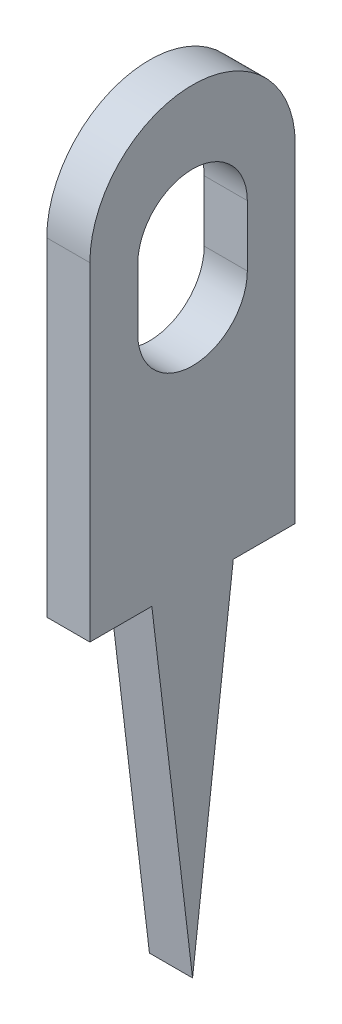
ISO-10303-21;
HEADER;
FILE_DESCRIPTION(('STEP AP214'),'2;1');
FILE_NAME('part.step','',(''),(''),'','','');
FILE_SCHEMA(('AUTOMOTIVE_DESIGN { 1 0 10303 214 1 1 1 1 }'));
ENDSEC;
DATA;
#1=APPLICATION_CONTEXT('core data for automotive mechanical design processes');
#2=APPLICATION_PROTOCOL_DEFINITION('international standard','automotive_design',2000,#1);
#3=PRODUCT_CONTEXT('',#1,'mechanical');
#4=PRODUCT('Part','Part','',(#3));
#5=PRODUCT_RELATED_PRODUCT_CATEGORY('part','',(#4));
#6=PRODUCT_DEFINITION_FORMATION('','',#4);
#7=PRODUCT_DEFINITION_CONTEXT('part definition',#1,'design');
#8=PRODUCT_DEFINITION('design','',#6,#7);
#9=PRODUCT_DEFINITION_SHAPE('','',#8);
#10=(LENGTH_UNIT() NAMED_UNIT(*) SI_UNIT(.MILLI.,.METRE.));
#11=(NAMED_UNIT(*) PLANE_ANGLE_UNIT() SI_UNIT($,.RADIAN.));
#12=(NAMED_UNIT(*) SI_UNIT($,.STERADIAN.) SOLID_ANGLE_UNIT());
#13=UNCERTAINTY_MEASURE_WITH_UNIT(LENGTH_MEASURE(1.E-05),#10,'distance_accuracy_value','');
#14=(GEOMETRIC_REPRESENTATION_CONTEXT(3) GLOBAL_UNCERTAINTY_ASSIGNED_CONTEXT((#13)) GLOBAL_UNIT_ASSIGNED_CONTEXT((#10,
#11,#12)) REPRESENTATION_CONTEXT('',''));
#15=CARTESIAN_POINT('',(0.,0.,0.));
#16=DIRECTION('',(0.,0.,1.));
#17=DIRECTION('',(1.,0.,0.));
#18=AXIS2_PLACEMENT_3D('',#15,#16,#17);
#19=CARTESIAN_POINT('',(-0.315,0.,0.595));
#20=DIRECTION('',(0.,-0.118166265014676,0.992993823652736));
#21=DIRECTION('',(0.,-0.992993823652736,-0.118166265014676));
#22=AXIS2_PLACEMENT_3D('',#19,#20,#21);
#23=PLANE('',#22);
#24=DIRECTION('',(1.,0.,0.));
#25=VECTOR('',#24,1.);
#26=CARTESIAN_POINT('',(-0.315,-5.,0.));
#27=LINE('',#26,#25);
#28=CARTESIAN_POINT('',(-0.315,-5.,0.));
#29=VERTEX_POINT('',#28);
#30=CARTESIAN_POINT('',(0.315,-5.,0.));
#31=VERTEX_POINT('',#30);
#32=EDGE_CURVE('E42',#29,#31,#27,.T.);
#33=ORIENTED_EDGE('',*,*,#32,.T.);
#34=DIRECTION('',(0.,-0.992993823652736,-0.118166265014676));
#35=VECTOR('',#34,1.);
#36=CARTESIAN_POINT('',(0.315,0.,0.595));
#37=LINE('',#36,#35);
#38=CARTESIAN_POINT('',(0.315,0.,0.595));
#39=VERTEX_POINT('',#38);
#40=EDGE_CURVE('E158',#39,#31,#37,.T.);
#41=ORIENTED_EDGE('',*,*,#40,.F.);
#42=DIRECTION('',(1.,0.,0.));
#43=VECTOR('',#42,1.);
#44=CARTESIAN_POINT('',(-0.315,0.,0.595));
#45=LINE('',#44,#43);
#46=CARTESIAN_POINT('',(-0.315,0.,0.595));
#47=VERTEX_POINT('',#46);
#48=EDGE_CURVE('E11',#47,#39,#45,.T.);
#49=ORIENTED_EDGE('',*,*,#48,.F.);
#50=DIRECTION('',(0.,-0.992993823652736,-0.118166265014676));
#51=VECTOR('',#50,1.);
#52=CARTESIAN_POINT('',(-0.315,0.,0.595));
#53=LINE('',#52,#51);
#54=EDGE_CURVE('E198',#47,#29,#53,.T.);
#55=ORIENTED_EDGE('',*,*,#54,.T.);
#56=EDGE_LOOP('',(#33,#41,#49,#55));
#57=FACE_BOUND('',#56,.T.);
#58=ADVANCED_FACE('F39',(#57),#23,.T.);
#59=CARTESIAN_POINT('',(-0.315,0.,1.5));
#60=DIRECTION('',(0.,-1.,0.));
#61=DIRECTION('',(0.,0.,-1.));
#62=AXIS2_PLACEMENT_3D('',#59,#60,#61);
#63=PLANE('',#62);
#64=ORIENTED_EDGE('',*,*,#48,.T.);
#65=DIRECTION('',(0.,0.,-1.));
#66=VECTOR('',#65,1.);
#67=CARTESIAN_POINT('',(0.315,0.,1.5));
#68=LINE('',#67,#66);
#69=CARTESIAN_POINT('',(0.315,0.,1.5));
#70=VERTEX_POINT('',#69);
#71=EDGE_CURVE('E182',#70,#39,#68,.T.);
#72=ORIENTED_EDGE('',*,*,#71,.F.);
#73=DIRECTION('',(1.,0.,0.));
#74=VECTOR('',#73,1.);
#75=CARTESIAN_POINT('',(-0.315,0.,1.5));
#76=LINE('',#75,#74);
#77=CARTESIAN_POINT('',(-0.315,0.,1.5));
#78=VERTEX_POINT('',#77);
#79=EDGE_CURVE('E48',#78,#70,#76,.T.);
#80=ORIENTED_EDGE('',*,*,#79,.F.);
#81=DIRECTION('',(0.,0.,-1.));
#82=VECTOR('',#81,1.);
#83=CARTESIAN_POINT('',(-0.315,0.,1.5));
#84=LINE('',#83,#82);
#85=EDGE_CURVE('E226',#78,#47,#84,.T.);
#86=ORIENTED_EDGE('',*,*,#85,.T.);
#87=EDGE_LOOP('',(#64,#72,#80,#86));
#88=FACE_BOUND('',#87,.T.);
#89=ADVANCED_FACE('F252',(#88),#63,.T.);
#90=CARTESIAN_POINT('',(-0.315,0.,1.5));
#91=DIRECTION('',(0.,0.,1.));
#92=DIRECTION('',(1.,0.,0.));
#93=AXIS2_PLACEMENT_3D('',#90,#91,#92);
#94=PLANE('',#93);
#95=ORIENTED_EDGE('',*,*,#79,.T.);
#96=DIRECTION('',(0.,-1.,0.));
#97=VECTOR('',#96,1.);
#98=CARTESIAN_POINT('',(0.315,0.,1.5));
#99=LINE('',#98,#97);
#100=CARTESIAN_POINT('',(0.315,4.8,1.5));
#101=VERTEX_POINT('',#100);
#102=EDGE_CURVE('E178',#101,#70,#99,.T.);
#103=ORIENTED_EDGE('',*,*,#102,.F.);
#104=DIRECTION('',(1.,0.,0.));
#105=VECTOR('',#104,1.);
#106=CARTESIAN_POINT('',(-0.315,4.8,1.5));
#107=LINE('',#106,#105);
#108=CARTESIAN_POINT('',(-0.315,4.8,1.5));
#109=VERTEX_POINT('',#108);
#110=EDGE_CURVE('E232',#109,#101,#107,.T.);
#111=ORIENTED_EDGE('',*,*,#110,.F.);
#112=DIRECTION('',(0.,-1.,0.));
#113=VECTOR('',#112,1.);
#114=CARTESIAN_POINT('',(-0.315,0.,1.5));
#115=LINE('',#114,#113);
#116=EDGE_CURVE('E222',#109,#78,#115,.T.);
#117=ORIENTED_EDGE('',*,*,#116,.T.);
#118=EDGE_LOOP('',(#95,#103,#111,#117));
#119=FACE_BOUND('',#118,.T.);
#120=ADVANCED_FACE('F269',(#119),#94,.T.);
#121=CARTESIAN_POINT('',(-0.315,4.8,0.));
#122=DIRECTION('',(1.,0.,0.));
#123=DIRECTION('',(0.,0.,-1.));
#124=AXIS2_PLACEMENT_3D('',#121,#122,#123);
#125=CYLINDRICAL_SURFACE('',#124,1.5);
#126=ORIENTED_EDGE('',*,*,#110,.T.);
#127=CARTESIAN_POINT('',(0.315,4.8,0.));
#128=DIRECTION('',(1.,0.,0.));
#129=DIRECTION('',(0.,0.,-1.));
#130=AXIS2_PLACEMENT_3D('',#127,#128,#129);
#131=CIRCLE('',#130,1.5);
#132=CARTESIAN_POINT('',(0.315,4.8,-1.5));
#133=VERTEX_POINT('',#132);
#134=EDGE_CURVE('E174',#133,#101,#131,.T.);
#135=ORIENTED_EDGE('',*,*,#134,.F.);
#136=DIRECTION('',(1.,0.,0.));
#137=VECTOR('',#136,1.);
#138=CARTESIAN_POINT('',(-0.315,4.8,-1.5));
#139=LINE('',#138,#137);
#140=CARTESIAN_POINT('',(-0.315,4.8,-1.5));
#141=VERTEX_POINT('',#140);
#142=EDGE_CURVE('E235',#141,#133,#139,.T.);
#143=ORIENTED_EDGE('',*,*,#142,.F.);
#144=CARTESIAN_POINT('',(-0.315,4.8,0.));
#145=DIRECTION('',(1.,0.,0.));
#146=DIRECTION('',(0.,0.,-1.));
#147=AXIS2_PLACEMENT_3D('',#144,#145,#146);
#148=CIRCLE('',#147,1.5);
#149=EDGE_CURVE('E218',#141,#109,#148,.T.);
#150=ORIENTED_EDGE('',*,*,#149,.T.);
#151=EDGE_LOOP('',(#126,#135,#143,#150));
#152=FACE_BOUND('',#151,.T.);
#153=ADVANCED_FACE('F267',(#152),#125,.T.);
#154=CARTESIAN_POINT('',(-0.315,0.,-1.5));
#155=DIRECTION('',(0.,0.,-1.));
#156=DIRECTION('',(-1.,0.,0.));
#157=AXIS2_PLACEMENT_3D('',#154,#155,#156);
#158=PLANE('',#157);
#159=ORIENTED_EDGE('',*,*,#142,.T.);
#160=DIRECTION('',(0.,1.,0.));
#161=VECTOR('',#160,1.);
#162=CARTESIAN_POINT('',(0.315,0.,-1.5));
#163=LINE('',#162,#161);
#164=CARTESIAN_POINT('',(0.315,0.,-1.5));
#165=VERTEX_POINT('',#164);
#166=EDGE_CURVE('E170',#165,#133,#163,.T.);
#167=ORIENTED_EDGE('',*,*,#166,.F.);
#168=DIRECTION('',(1.,0.,0.));
#169=VECTOR('',#168,1.);
#170=CARTESIAN_POINT('',(-0.315,0.,-1.5));
#171=LINE('',#170,#169);
#172=CARTESIAN_POINT('',(-0.315,0.,-1.5));
#173=VERTEX_POINT('',#172);
#174=EDGE_CURVE('E238',#173,#165,#171,.T.);
#175=ORIENTED_EDGE('',*,*,#174,.F.);
#176=DIRECTION('',(0.,1.,0.));
#177=VECTOR('',#176,1.);
#178=CARTESIAN_POINT('',(-0.315,0.,-1.5));
#179=LINE('',#178,#177);
#180=EDGE_CURVE('E214',#173,#141,#179,.T.);
#181=ORIENTED_EDGE('',*,*,#180,.T.);
#182=EDGE_LOOP('',(#159,#167,#175,#181));
#183=FACE_BOUND('',#182,.T.);
#184=ADVANCED_FACE('F265',(#183),#158,.T.);
#185=CARTESIAN_POINT('',(-0.315,0.,-1.5));
#186=DIRECTION('',(0.,-1.,0.));
#187=DIRECTION('',(0.,0.,-1.));
#188=AXIS2_PLACEMENT_3D('',#185,#186,#187);
#189=PLANE('',#188);
#190=ORIENTED_EDGE('',*,*,#174,.T.);
#191=DIRECTION('',(0.,0.,-1.));
#192=VECTOR('',#191,1.);
#193=CARTESIAN_POINT('',(0.315,0.,-1.5));
#194=LINE('',#193,#192);
#195=CARTESIAN_POINT('',(0.315,0.,-0.595));
#196=VERTEX_POINT('',#195);
#197=EDGE_CURVE('E166',#196,#165,#194,.T.);
#198=ORIENTED_EDGE('',*,*,#197,.F.);
#199=DIRECTION('',(1.,0.,0.));
#200=VECTOR('',#199,1.);
#201=CARTESIAN_POINT('',(-0.315,0.,-0.595));
#202=LINE('',#201,#200);
#203=CARTESIAN_POINT('',(-0.315,0.,-0.595));
#204=VERTEX_POINT('',#203);
#205=EDGE_CURVE('E240',#204,#196,#202,.T.);
#206=ORIENTED_EDGE('',*,*,#205,.F.);
#207=DIRECTION('',(0.,0.,-1.));
#208=VECTOR('',#207,1.);
#209=CARTESIAN_POINT('',(-0.315,0.,-1.5));
#210=LINE('',#209,#208);
#211=EDGE_CURVE('E210',#204,#173,#210,.T.);
#212=ORIENTED_EDGE('',*,*,#211,.T.);
#213=EDGE_LOOP('',(#190,#198,#206,#212));
#214=FACE_BOUND('',#213,.T.);
#215=ADVANCED_FACE('F261',(#214),#189,.T.);
#216=CARTESIAN_POINT('',(-0.315,0.,-0.595));
#217=DIRECTION('',(0.,-0.118166265014676,-0.992993823652736));
#218=DIRECTION('',(0.,0.992993823652736,-0.118166265014676));
#219=AXIS2_PLACEMENT_3D('',#216,#217,#218);
#220=PLANE('',#219);
#221=ORIENTED_EDGE('',*,*,#205,.T.);
#222=DIRECTION('',(0.,0.992993823652736,-0.118166265014676));
#223=VECTOR('',#222,1.);
#224=CARTESIAN_POINT('',(0.315,0.,-0.595));
#225=LINE('',#224,#223);
#226=EDGE_CURVE('E162',#31,#196,#225,.T.);
#227=ORIENTED_EDGE('',*,*,#226,.F.);
#228=ORIENTED_EDGE('',*,*,#32,.F.);
#229=DIRECTION('',(0.,0.992993823652736,-0.118166265014676));
#230=VECTOR('',#229,1.);
#231=CARTESIAN_POINT('',(-0.315,0.,-0.595));
#232=LINE('',#231,#230);
#233=EDGE_CURVE('E206',#29,#204,#232,.T.);
#234=ORIENTED_EDGE('',*,*,#233,.T.);
#235=EDGE_LOOP('',(#221,#227,#228,#234));
#236=FACE_BOUND('',#235,.T.);
#237=ADVANCED_FACE('F246',(#236),#220,.T.);
#238=CARTESIAN_POINT('',(-0.315,4.8,0.));
#239=DIRECTION('',(1.,0.,0.));
#240=DIRECTION('',(0.,0.,-1.));
#241=AXIS2_PLACEMENT_3D('',#238,#239,#240);
#242=PLANE('',#241);
#243=DIRECTION('',(0.,-1.,0.));
#244=VECTOR('',#243,1.);
#245=CARTESIAN_POINT('',(-0.315,3.545,0.8));
#246=LINE('',#245,#244);
#247=CARTESIAN_POINT('',(-0.315,4.435,0.8));
#248=VERTEX_POINT('',#247);
#249=CARTESIAN_POINT('',(-0.315,3.545,0.8));
#250=VERTEX_POINT('',#249);
#251=EDGE_CURVE('E136',#248,#250,#246,.T.);
#252=ORIENTED_EDGE('',*,*,#251,.T.);
#253=CARTESIAN_POINT('',(-0.315,3.545,0.));
#254=DIRECTION('',(1.,0.,0.));
#255=DIRECTION('',(0.,0.,-1.));
#256=AXIS2_PLACEMENT_3D('',#253,#254,#255);
#257=CIRCLE('',#256,0.8);
#258=CARTESIAN_POINT('',(-0.315,3.545,-0.8));
#259=VERTEX_POINT('',#258);
#260=EDGE_CURVE('E186',#250,#259,#257,.T.);
#261=ORIENTED_EDGE('',*,*,#260,.T.);
#262=DIRECTION('',(0.,1.,0.));
#263=VECTOR('',#262,1.);
#264=CARTESIAN_POINT('',(-0.315,3.545,-0.8));
#265=LINE('',#264,#263);
#266=CARTESIAN_POINT('',(-0.315,4.435,-0.8));
#267=VERTEX_POINT('',#266);
#268=EDGE_CURVE('E130',#259,#267,#265,.T.);
#269=ORIENTED_EDGE('',*,*,#268,.T.);
#270=CARTESIAN_POINT('',(-0.315,4.435,0.));
#271=DIRECTION('',(1.,0.,0.));
#272=DIRECTION('',(0.,0.,-1.));
#273=AXIS2_PLACEMENT_3D('',#270,#271,#272);
#274=CIRCLE('',#273,0.8);
#275=EDGE_CURVE('E56',#267,#248,#274,.T.);
#276=ORIENTED_EDGE('',*,*,#275,.T.);
#277=EDGE_LOOP('',(#252,#261,#269,#276));
#278=FACE_BOUND('',#277,.T.);
#279=ORIENTED_EDGE('',*,*,#54,.F.);
#280=ORIENTED_EDGE('',*,*,#85,.F.);
#281=ORIENTED_EDGE('',*,*,#116,.F.);
#282=ORIENTED_EDGE('',*,*,#149,.F.);
#283=ORIENTED_EDGE('',*,*,#180,.F.);
#284=ORIENTED_EDGE('',*,*,#211,.F.);
#285=ORIENTED_EDGE('',*,*,#233,.F.);
#286=EDGE_LOOP('',(#279,#280,#281,#282,#283,#284,#285));
#287=FACE_BOUND('',#286,.T.);
#288=ADVANCED_FACE('F256',(#278,#287),#242,.F.);
#289=CARTESIAN_POINT('',(-0.315,3.545,0.));
#290=DIRECTION('',(1.,0.,0.));
#291=DIRECTION('',(0.,0.,-1.));
#292=AXIS2_PLACEMENT_3D('',#289,#290,#291);
#293=CYLINDRICAL_SURFACE('',#292,0.8);
#294=DIRECTION('',(1.,0.,0.));
#295=VECTOR('',#294,1.);
#296=CARTESIAN_POINT('',(-0.315,3.545,0.8));
#297=LINE('',#296,#295);
#298=CARTESIAN_POINT('',(0.315,3.545,0.8));
#299=VERTEX_POINT('',#298);
#300=EDGE_CURVE('E141',#250,#299,#297,.T.);
#301=ORIENTED_EDGE('',*,*,#300,.T.);
#302=CARTESIAN_POINT('',(0.315,3.545,0.));
#303=DIRECTION('',(1.,0.,0.));
#304=DIRECTION('',(0.,0.,-1.));
#305=AXIS2_PLACEMENT_3D('',#302,#303,#304);
#306=CIRCLE('',#305,0.8);
#307=CARTESIAN_POINT('',(0.315,3.545,-0.8));
#308=VERTEX_POINT('',#307);
#309=EDGE_CURVE('E139',#299,#308,#306,.T.);
#310=ORIENTED_EDGE('',*,*,#309,.T.);
#311=DIRECTION('',(1.,0.,0.));
#312=VECTOR('',#311,1.);
#313=CARTESIAN_POINT('',(-0.315,3.545,-0.8));
#314=LINE('',#313,#312);
#315=EDGE_CURVE('E123',#259,#308,#314,.T.);
#316=ORIENTED_EDGE('',*,*,#315,.F.);
#317=ORIENTED_EDGE('',*,*,#260,.F.);
#318=EDGE_LOOP('',(#301,#310,#316,#317));
#319=FACE_BOUND('',#318,.T.);
#320=ADVANCED_FACE('F140',(#319),#293,.F.);
#321=CARTESIAN_POINT('',(-0.315,3.545,0.8));
#322=DIRECTION('',(0.,0.,1.));
#323=DIRECTION('',(0.,-1.,0.));
#324=AXIS2_PLACEMENT_3D('',#321,#322,#323);
#325=PLANE('',#324);
#326=DIRECTION('',(1.,0.,0.));
#327=VECTOR('',#326,1.);
#328=CARTESIAN_POINT('',(-0.315,4.435,0.8));
#329=LINE('',#328,#327);
#330=CARTESIAN_POINT('',(0.315,4.435,0.8));
#331=VERTEX_POINT('',#330);
#332=EDGE_CURVE('E199',#248,#331,#329,.T.);
#333=ORIENTED_EDGE('',*,*,#332,.T.);
#334=DIRECTION('',(0.,-1.,0.));
#335=VECTOR('',#334,1.);
#336=CARTESIAN_POINT('',(0.315,3.545,0.8));
#337=LINE('',#336,#335);
#338=EDGE_CURVE('E153',#331,#299,#337,.T.);
#339=ORIENTED_EDGE('',*,*,#338,.T.);
#340=ORIENTED_EDGE('',*,*,#300,.F.);
#341=ORIENTED_EDGE('',*,*,#251,.F.);
#342=EDGE_LOOP('',(#333,#339,#340,#341));
#343=FACE_BOUND('',#342,.T.);
#344=ADVANCED_FACE('F336',(#343),#325,.F.);
#345=CARTESIAN_POINT('',(-0.315,4.435,0.));
#346=DIRECTION('',(1.,0.,0.));
#347=DIRECTION('',(0.,0.,-1.));
#348=AXIS2_PLACEMENT_3D('',#345,#346,#347);
#349=CYLINDRICAL_SURFACE('',#348,0.8);
#350=DIRECTION('',(1.,0.,0.));
#351=VECTOR('',#350,1.);
#352=CARTESIAN_POINT('',(-0.315,4.435,-0.8));
#353=LINE('',#352,#351);
#354=CARTESIAN_POINT('',(0.315,4.435,-0.8));
#355=VERTEX_POINT('',#354);
#356=EDGE_CURVE('E135',#267,#355,#353,.T.);
#357=ORIENTED_EDGE('',*,*,#356,.T.);
#358=CARTESIAN_POINT('',(0.315,4.435,0.));
#359=DIRECTION('',(1.,0.,0.));
#360=DIRECTION('',(0.,0.,-1.));
#361=AXIS2_PLACEMENT_3D('',#358,#359,#360);
#362=CIRCLE('',#361,0.8);
#363=EDGE_CURVE('E149',#355,#331,#362,.T.);
#364=ORIENTED_EDGE('',*,*,#363,.T.);
#365=ORIENTED_EDGE('',*,*,#332,.F.);
#366=ORIENTED_EDGE('',*,*,#275,.F.);
#367=EDGE_LOOP('',(#357,#364,#365,#366));
#368=FACE_BOUND('',#367,.T.);
#369=ADVANCED_FACE('F345',(#368),#349,.F.);
#370=CARTESIAN_POINT('',(-0.315,3.545,-0.8));
#371=DIRECTION('',(0.,0.,-1.));
#372=DIRECTION('',(0.,1.,0.));
#373=AXIS2_PLACEMENT_3D('',#370,#371,#372);
#374=PLANE('',#373);
#375=ORIENTED_EDGE('',*,*,#315,.T.);
#376=DIRECTION('',(0.,1.,0.));
#377=VECTOR('',#376,1.);
#378=CARTESIAN_POINT('',(0.315,3.545,-0.8));
#379=LINE('',#378,#377);
#380=EDGE_CURVE('E127',#308,#355,#379,.T.);
#381=ORIENTED_EDGE('',*,*,#380,.T.);
#382=ORIENTED_EDGE('',*,*,#356,.F.);
#383=ORIENTED_EDGE('',*,*,#268,.F.);
#384=EDGE_LOOP('',(#375,#381,#382,#383));
#385=FACE_BOUND('',#384,.T.);
#386=ADVANCED_FACE('F125',(#385),#374,.F.);
#387=CARTESIAN_POINT('',(0.315,4.8,0.));
#388=DIRECTION('',(1.,0.,0.));
#389=DIRECTION('',(0.,0.,-1.));
#390=AXIS2_PLACEMENT_3D('',#387,#388,#389);
#391=PLANE('',#390);
#392=ORIENTED_EDGE('',*,*,#40,.T.);
#393=ORIENTED_EDGE('',*,*,#226,.T.);
#394=ORIENTED_EDGE('',*,*,#197,.T.);
#395=ORIENTED_EDGE('',*,*,#166,.T.);
#396=ORIENTED_EDGE('',*,*,#134,.T.);
#397=ORIENTED_EDGE('',*,*,#102,.T.);
#398=ORIENTED_EDGE('',*,*,#71,.T.);
#399=EDGE_LOOP('',(#392,#393,#394,#395,#396,#397,#398));
#400=FACE_BOUND('',#399,.T.);
#401=ORIENTED_EDGE('',*,*,#380,.F.);
#402=ORIENTED_EDGE('',*,*,#309,.F.);
#403=ORIENTED_EDGE('',*,*,#338,.F.);
#404=ORIENTED_EDGE('',*,*,#363,.F.);
#405=EDGE_LOOP('',(#401,#402,#403,#404));
#406=FACE_BOUND('',#405,.T.);
#407=ADVANCED_FACE('F147',(#400,#406),#391,.T.);
#408=CLOSED_SHELL('',(#58,#89,#120,#153,#184,#215,#237,#288,#320,#344,#369,#386,#407));
#409=MANIFOLD_SOLID_BREP('B2',#408);
#410=ADVANCED_BREP_SHAPE_REPRESENTATION('',(#18,#409),#14);
#411=SHAPE_DEFINITION_REPRESENTATION(#9,#410);
ENDSEC;
END-ISO-10303-21;
